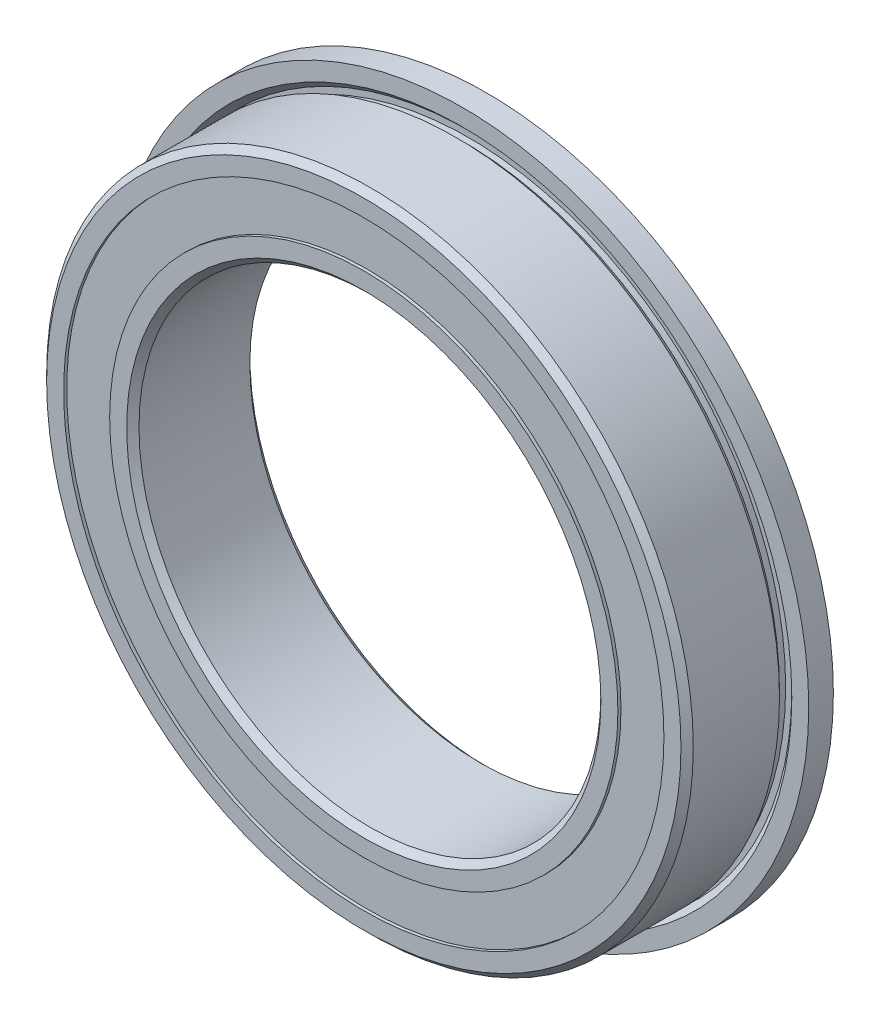
ISO-10303-21;
HEADER;
FILE_DESCRIPTION(('STEP AP214'),'2;1');
FILE_NAME('part.step','',(''),(''),'','','');
FILE_SCHEMA(('AUTOMOTIVE_DESIGN { 1 0 10303 214 1 1 1 1 }'));
ENDSEC;
DATA;
#1=APPLICATION_CONTEXT('core data for automotive mechanical design processes');
#2=APPLICATION_PROTOCOL_DEFINITION('international standard','automotive_design',2000,#1);
#3=PRODUCT_CONTEXT('',#1,'mechanical');
#4=PRODUCT('Part','Part','',(#3));
#5=PRODUCT_RELATED_PRODUCT_CATEGORY('part','',(#4));
#6=PRODUCT_DEFINITION_FORMATION('','',#4);
#7=PRODUCT_DEFINITION_CONTEXT('part definition',#1,'design');
#8=PRODUCT_DEFINITION('design','',#6,#7);
#9=PRODUCT_DEFINITION_SHAPE('','',#8);
#10=(LENGTH_UNIT() NAMED_UNIT(*) SI_UNIT(.MILLI.,.METRE.));
#11=(NAMED_UNIT(*) PLANE_ANGLE_UNIT() SI_UNIT($,.RADIAN.));
#12=(NAMED_UNIT(*) SI_UNIT($,.STERADIAN.) SOLID_ANGLE_UNIT());
#13=UNCERTAINTY_MEASURE_WITH_UNIT(LENGTH_MEASURE(1.E-05),#10,'distance_accuracy_value','');
#14=(GEOMETRIC_REPRESENTATION_CONTEXT(3) GLOBAL_UNCERTAINTY_ASSIGNED_CONTEXT((#13)) GLOBAL_UNIT_ASSIGNED_CONTEXT((#10,
#11,#12)) REPRESENTATION_CONTEXT('',''));
#15=CARTESIAN_POINT('',(0.,0.,0.));
#16=DIRECTION('',(0.,0.,1.));
#17=DIRECTION('',(1.,0.,0.));
#18=AXIS2_PLACEMENT_3D('',#15,#16,#17);
#19=CARTESIAN_POINT('',(0.,9.74725274725274,-1.90000000000001));
#20=DIRECTION('',(0.,0.,1.));
#21=DIRECTION('',(1.,0.,0.));
#22=AXIS2_PLACEMENT_3D('',#19,#20,#21);
#23=PLANE('',#22);
#24=CARTESIAN_POINT('',(0.,0.,-1.90000000000001));
#25=DIRECTION('',(0.,0.,1.));
#26=DIRECTION('',(1.,0.,0.));
#27=AXIS2_PLACEMENT_3D('',#24,#25,#26);
#28=CIRCLE('',#27,9.74725274725274);
#29=CARTESIAN_POINT('',(9.74725274725274,0.,-1.90000000000001));
#30=VERTEX_POINT('',#29);
#31=EDGE_CURVE('E74',#30,#30,#28,.T.);
#32=ORIENTED_EDGE('',*,*,#31,.F.);
#33=EDGE_LOOP('',(#32));
#34=FACE_BOUND('',#33,.T.);
#35=CARTESIAN_POINT('',(0.,0.,-1.90000000000001));
#36=DIRECTION('',(0.,0.,1.));
#37=DIRECTION('',(1.,0.,0.));
#38=AXIS2_PLACEMENT_3D('',#35,#36,#37);
#39=CIRCLE('',#38,8.25274725274726);
#40=CARTESIAN_POINT('',(8.25274725274726,0.,-1.90000000000001));
#41=VERTEX_POINT('',#40);
#42=EDGE_CURVE('E11',#41,#41,#39,.T.);
#43=ORIENTED_EDGE('',*,*,#42,.T.);
#44=EDGE_LOOP('',(#43));
#45=FACE_BOUND('',#44,.T.);
#46=ADVANCED_FACE('F56',(#34,#45),#23,.F.);
#47=CARTESIAN_POINT('',(0.,0.,2.));
#48=DIRECTION('',(0.,0.,1.));
#49=DIRECTION('',(1.,0.,0.));
#50=AXIS2_PLACEMENT_3D('',#47,#48,#49);
#51=CYLINDRICAL_SURFACE('',#50,8.25274725274726);
#52=ORIENTED_EDGE('',*,*,#42,.F.);
#53=EDGE_LOOP('',(#52));
#54=FACE_BOUND('',#53,.T.);
#55=CARTESIAN_POINT('',(0.,0.,-1.16125368678291));
#56=DIRECTION('',(0.,0.,1.));
#57=DIRECTION('',(1.,0.,0.));
#58=AXIS2_PLACEMENT_3D('',#55,#56,#57);
#59=CIRCLE('',#58,8.25274725274726);
#60=CARTESIAN_POINT('',(8.25274725274726,0.,-1.16125368678291));
#61=VERTEX_POINT('',#60);
#62=EDGE_CURVE('E62',#61,#61,#59,.T.);
#63=ORIENTED_EDGE('',*,*,#62,.T.);
#64=EDGE_LOOP('',(#63));
#65=FACE_BOUND('',#64,.T.);
#66=ADVANCED_FACE('F84',(#54,#65),#51,.F.);
#67=CARTESIAN_POINT('',(0.,9.74725274725274,-1.16125368678291));
#68=DIRECTION('',(0.,0.,-1.));
#69=DIRECTION('',(-1.,0.,0.));
#70=AXIS2_PLACEMENT_3D('',#67,#68,#69);
#71=PLANE('',#70);
#72=ORIENTED_EDGE('',*,*,#62,.F.);
#73=EDGE_LOOP('',(#72));
#74=FACE_BOUND('',#73,.T.);
#75=CARTESIAN_POINT('',(0.,0.,-1.16125368678291));
#76=DIRECTION('',(0.,0.,1.));
#77=DIRECTION('',(1.,0.,0.));
#78=AXIS2_PLACEMENT_3D('',#75,#76,#77);
#79=CIRCLE('',#78,9.74725274725274);
#80=CARTESIAN_POINT('',(9.74725274725274,0.,-1.16125368678291));
#81=VERTEX_POINT('',#80);
#82=EDGE_CURVE('E67',#81,#81,#79,.T.);
#83=ORIENTED_EDGE('',*,*,#82,.T.);
#84=EDGE_LOOP('',(#83));
#85=FACE_BOUND('',#84,.T.);
#86=ADVANCED_FACE('F89',(#74,#85),#71,.F.);
#87=CARTESIAN_POINT('',(0.,0.,2.));
#88=DIRECTION('',(0.,0.,1.));
#89=DIRECTION('',(1.,0.,0.));
#90=AXIS2_PLACEMENT_3D('',#87,#88,#89);
#91=CYLINDRICAL_SURFACE('',#90,9.74725274725274);
#92=ORIENTED_EDGE('',*,*,#82,.F.);
#93=EDGE_LOOP('',(#92));
#94=FACE_BOUND('',#93,.T.);
#95=ORIENTED_EDGE('',*,*,#31,.T.);
#96=EDGE_LOOP('',(#95));
#97=FACE_BOUND('',#96,.T.);
#98=ADVANCED_FACE('F81',(#94,#97),#91,.T.);
#99=CLOSED_SHELL('',(#46,#66,#86,#98));
#100=MANIFOLD_SOLID_BREP('B2',#99);
#101=CARTESIAN_POINT('',(0.,9.74725274725274,1.90000000000001));
#102=DIRECTION('',(0.,0.,-1.));
#103=DIRECTION('',(-1.,0.,0.));
#104=AXIS2_PLACEMENT_3D('',#101,#102,#103);
#105=PLANE('',#104);
#106=CARTESIAN_POINT('',(0.,0.,1.90000000000001));
#107=DIRECTION('',(0.,0.,1.));
#108=DIRECTION('',(1.,0.,0.));
#109=AXIS2_PLACEMENT_3D('',#106,#107,#108);
#110=CIRCLE('',#109,8.25274725274726);
#111=CARTESIAN_POINT('',(8.25274725274726,0.,1.90000000000001));
#112=VERTEX_POINT('',#111);
#113=EDGE_CURVE('E55',#112,#112,#110,.T.);
#114=ORIENTED_EDGE('',*,*,#113,.F.);
#115=EDGE_LOOP('',(#114));
#116=FACE_BOUND('',#115,.T.);
#117=CARTESIAN_POINT('',(0.,0.,1.90000000000001));
#118=DIRECTION('',(0.,0.,1.));
#119=DIRECTION('',(1.,0.,0.));
#120=AXIS2_PLACEMENT_3D('',#117,#118,#119);
#121=CIRCLE('',#120,9.74725274725274);
#122=CARTESIAN_POINT('',(9.74725274725274,0.,1.90000000000001));
#123=VERTEX_POINT('',#122);
#124=EDGE_CURVE('E146',#123,#123,#121,.T.);
#125=ORIENTED_EDGE('',*,*,#124,.T.);
#126=EDGE_LOOP('',(#125));
#127=FACE_BOUND('',#126,.T.);
#128=ADVANCED_FACE('F126',(#116,#127),#105,.F.);
#129=CARTESIAN_POINT('',(0.,0.,2.));
#130=DIRECTION('',(0.,0.,1.));
#131=DIRECTION('',(1.,0.,0.));
#132=AXIS2_PLACEMENT_3D('',#129,#130,#131);
#133=CYLINDRICAL_SURFACE('',#132,8.25274725274726);
#134=CARTESIAN_POINT('',(0.,0.,1.16125368678291));
#135=DIRECTION('',(0.,0.,1.));
#136=DIRECTION('',(1.,0.,0.));
#137=AXIS2_PLACEMENT_3D('',#134,#135,#136);
#138=CIRCLE('',#137,8.25274725274726);
#139=CARTESIAN_POINT('',(8.25274725274726,0.,1.16125368678291));
#140=VERTEX_POINT('',#139);
#141=EDGE_CURVE('E133',#140,#140,#138,.T.);
#142=ORIENTED_EDGE('',*,*,#141,.F.);
#143=EDGE_LOOP('',(#142));
#144=FACE_BOUND('',#143,.T.);
#145=ORIENTED_EDGE('',*,*,#113,.T.);
#146=EDGE_LOOP('',(#145));
#147=FACE_BOUND('',#146,.T.);
#148=ADVANCED_FACE('F162',(#144,#147),#133,.F.);
#149=CARTESIAN_POINT('',(0.,9.74725274725274,1.16125368678291));
#150=DIRECTION('',(0.,0.,1.));
#151=DIRECTION('',(1.,0.,0.));
#152=AXIS2_PLACEMENT_3D('',#149,#150,#151);
#153=PLANE('',#152);
#154=CARTESIAN_POINT('',(0.,0.,1.16125368678291));
#155=DIRECTION('',(0.,0.,1.));
#156=DIRECTION('',(1.,0.,0.));
#157=AXIS2_PLACEMENT_3D('',#154,#155,#156);
#158=CIRCLE('',#157,9.74725274725274);
#159=CARTESIAN_POINT('',(9.74725274725274,0.,1.16125368678291));
#160=VERTEX_POINT('',#159);
#161=EDGE_CURVE('E140',#160,#160,#158,.T.);
#162=ORIENTED_EDGE('',*,*,#161,.F.);
#163=EDGE_LOOP('',(#162));
#164=FACE_BOUND('',#163,.T.);
#165=ORIENTED_EDGE('',*,*,#141,.T.);
#166=EDGE_LOOP('',(#165));
#167=FACE_BOUND('',#166,.T.);
#168=ADVANCED_FACE('F157',(#164,#167),#153,.F.);
#169=CARTESIAN_POINT('',(0.,0.,2.));
#170=DIRECTION('',(0.,0.,1.));
#171=DIRECTION('',(1.,0.,0.));
#172=AXIS2_PLACEMENT_3D('',#169,#170,#171);
#173=CYLINDRICAL_SURFACE('',#172,9.74725274725274);
#174=ORIENTED_EDGE('',*,*,#124,.F.);
#175=EDGE_LOOP('',(#174));
#176=FACE_BOUND('',#175,.T.);
#177=ORIENTED_EDGE('',*,*,#161,.T.);
#178=EDGE_LOOP('',(#177));
#179=FACE_BOUND('',#178,.T.);
#180=ADVANCED_FACE('F154',(#176,#179),#173,.T.);
#181=CLOSED_SHELL('',(#128,#148,#168,#180));
#182=MANIFOLD_SOLID_BREP('B6',#181);
#183=CARTESIAN_POINT('',(-4.18250854839382,7.96910423087894,0.));
#184=DIRECTION('',(0.,0.,1.));
#185=DIRECTION('',(-0.464723172043757,0.885456025653216,0.));
#186=AXIS2_PLACEMENT_3D('',#183,#184,#185);
#187=SPHERICAL_SURFACE('',#186,1.16125368678291);
#188=CARTESIAN_POINT('',(-4.18250854839382,7.96910423087894,1.16125368678291));
#189=VERTEX_POINT('',#188);
#190=VERTEX_LOOP('',#189);
#191=FACE_BOUND('',#190,.T.);
#192=ADVANCED_FACE('F194',(#191),#187,.T.);
#193=CLOSED_SHELL('',(#192));
#194=MANIFOLD_SOLID_BREP('B50',#193);
#195=CARTESIAN_POINT('',(-7.40685479304284,5.11258272058049,0.));
#196=DIRECTION('',(0.,0.,1.));
#197=DIRECTION('',(-0.822983865893649,0.568064746731166,0.));
#198=AXIS2_PLACEMENT_3D('',#195,#196,#197);
#199=SPHERICAL_SURFACE('',#198,1.16125368678291);
#200=CARTESIAN_POINT('',(-7.40685479304284,5.11258272058049,1.16125368678291));
#201=VERTEX_POINT('',#200);
#202=VERTEX_LOOP('',#201);
#203=FACE_BOUND('',#202,.T.);
#204=ADVANCED_FACE('F213',(#203),#199,.T.);
#205=CLOSED_SHELL('',(#204));
#206=MANIFOLD_SOLID_BREP('B122',#205);
#207=CARTESIAN_POINT('',(-8.93437986688247,1.084830122298,0.));
#208=DIRECTION('',(0.,0.,1.));
#209=DIRECTION('',(-0.992708874098053,0.120536680255334,0.));
#210=AXIS2_PLACEMENT_3D('',#207,#208,#209);
#211=SPHERICAL_SURFACE('',#210,1.16125368678291);
#212=CARTESIAN_POINT('',(-8.93437986688247,1.084830122298,1.16125368678291));
#213=VERTEX_POINT('',#212);
#214=VERTEX_LOOP('',#213);
#215=FACE_BOUND('',#214,.T.);
#216=ADVANCED_FACE('F232',(#215),#211,.T.);
#217=CLOSED_SHELL('',(#216));
#218=MANIFOLD_SOLID_BREP('B190',#217);
#219=CARTESIAN_POINT('',(-8.41514618416876,-3.19144398338274,0.));
#220=DIRECTION('',(0.,0.,1.));
#221=DIRECTION('',(-0.935016242685418,-0.354604887042527,0.));
#222=AXIS2_PLACEMENT_3D('',#219,#220,#221);
#223=SPHERICAL_SURFACE('',#222,1.16125368678291);
#224=CARTESIAN_POINT('',(-8.41514618416876,-3.19144398338274,1.16125368678291));
#225=VERTEX_POINT('',#224);
#226=VERTEX_LOOP('',#225);
#227=FACE_BOUND('',#226,.T.);
#228=ADVANCED_FACE('F251',(#227),#223,.T.);
#229=CLOSED_SHELL('',(#228));
#230=MANIFOLD_SOLID_BREP('B209',#229);
#231=CARTESIAN_POINT('',(-5.96810392416721,-6.73659673353986,0.));
#232=DIRECTION('',(0.,0.,1.));
#233=DIRECTION('',(-0.663122658240802,-0.748510748171095,0.));
#234=AXIS2_PLACEMENT_3D('',#231,#232,#233);
#235=SPHERICAL_SURFACE('',#234,1.16125368678291);
#236=CARTESIAN_POINT('',(-5.96810392416721,-6.73659673353986,1.16125368678291));
#237=VERTEX_POINT('',#236);
#238=VERTEX_LOOP('',#237);
#239=FACE_BOUND('',#238,.T.);
#240=ADVANCED_FACE('F270',(#239),#235,.T.);
#241=CLOSED_SHELL('',(#240));
#242=MANIFOLD_SOLID_BREP('B228',#241);
#243=CARTESIAN_POINT('',(-2.15384097858809,-8.73847635683445,0.));
#244=DIRECTION('',(0.,0.,1.));
#245=DIRECTION('',(-0.239315664287565,-0.97094181742605,0.));
#246=AXIS2_PLACEMENT_3D('',#243,#244,#245);
#247=SPHERICAL_SURFACE('',#246,1.16125368678291);
#248=CARTESIAN_POINT('',(-2.15384097858809,-8.73847635683445,1.16125368678291));
#249=VERTEX_POINT('',#248);
#250=VERTEX_LOOP('',#249);
#251=FACE_BOUND('',#250,.T.);
#252=ADVANCED_FACE('F289',(#251),#247,.T.);
#253=CLOSED_SHELL('',(#252));
#254=MANIFOLD_SOLID_BREP('B247',#253);
#255=CARTESIAN_POINT('',(2.15384097858796,-8.73847635683448,0.));
#256=DIRECTION('',(0.,0.,1.));
#257=DIRECTION('',(0.239315664287552,-0.970941817426054,0.));
#258=AXIS2_PLACEMENT_3D('',#255,#256,#257);
#259=SPHERICAL_SURFACE('',#258,1.16125368678291);
#260=CARTESIAN_POINT('',(2.15384097858796,-8.73847635683448,1.16125368678291));
#261=VERTEX_POINT('',#260);
#262=VERTEX_LOOP('',#261);
#263=FACE_BOUND('',#262,.T.);
#264=ADVANCED_FACE('F308',(#263),#259,.T.);
#265=CLOSED_SHELL('',(#264));
#266=MANIFOLD_SOLID_BREP('B266',#265);
#267=CARTESIAN_POINT('',(5.96810392416712,-6.73659673353994,0.));
#268=DIRECTION('',(0.,0.,1.));
#269=DIRECTION('',(0.663122658240791,-0.748510748171105,0.));
#270=AXIS2_PLACEMENT_3D('',#267,#268,#269);
#271=SPHERICAL_SURFACE('',#270,1.16125368678291);
#272=CARTESIAN_POINT('',(5.96810392416712,-6.73659673353994,1.16125368678291));
#273=VERTEX_POINT('',#272);
#274=VERTEX_LOOP('',#273);
#275=FACE_BOUND('',#274,.T.);
#276=ADVANCED_FACE('F327',(#275),#271,.T.);
#277=CLOSED_SHELL('',(#276));
#278=MANIFOLD_SOLID_BREP('B285',#277);
#279=CARTESIAN_POINT('',(8.41514618416872,-3.19144398338286,0.));
#280=DIRECTION('',(0.,0.,1.));
#281=DIRECTION('',(0.935016242685413,-0.35460488704254,0.));
#282=AXIS2_PLACEMENT_3D('',#279,#280,#281);
#283=SPHERICAL_SURFACE('',#282,1.16125368678291);
#284=CARTESIAN_POINT('',(8.41514618416872,-3.19144398338286,1.16125368678291));
#285=VERTEX_POINT('',#284);
#286=VERTEX_LOOP('',#285);
#287=FACE_BOUND('',#286,.T.);
#288=ADVANCED_FACE('F346',(#287),#283,.T.);
#289=CLOSED_SHELL('',(#288));
#290=MANIFOLD_SOLID_BREP('B304',#289);
#291=CARTESIAN_POINT('',(8.93437986688249,1.08483012229788,0.));
#292=DIRECTION('',(0.,0.,1.));
#293=DIRECTION('',(0.992708874098054,0.12053668025532,0.));
#294=AXIS2_PLACEMENT_3D('',#291,#292,#293);
#295=SPHERICAL_SURFACE('',#294,1.16125368678291);
#296=CARTESIAN_POINT('',(8.93437986688249,1.08483012229788,1.16125368678291));
#297=VERTEX_POINT('',#296);
#298=VERTEX_LOOP('',#297);
#299=FACE_BOUND('',#298,.T.);
#300=ADVANCED_FACE('F365',(#299),#295,.T.);
#301=CLOSED_SHELL('',(#300));
#302=MANIFOLD_SOLID_BREP('B323',#301);
#303=CARTESIAN_POINT('',(7.40685479304292,5.11258272058039,0.));
#304=DIRECTION('',(0.,0.,1.));
#305=DIRECTION('',(0.822983865893658,0.568064746731154,0.));
#306=AXIS2_PLACEMENT_3D('',#303,#304,#305);
#307=SPHERICAL_SURFACE('',#306,1.16125368678291);
#308=CARTESIAN_POINT('',(7.40685479304292,5.11258272058039,1.16125368678291));
#309=VERTEX_POINT('',#308);
#310=VERTEX_LOOP('',#309);
#311=FACE_BOUND('',#310,.T.);
#312=ADVANCED_FACE('F384',(#311),#307,.T.);
#313=CLOSED_SHELL('',(#312));
#314=MANIFOLD_SOLID_BREP('B342',#313);
#315=CARTESIAN_POINT('',(4.18250854839392,7.96910423087888,0.));
#316=DIRECTION('',(0.,0.,1.));
#317=DIRECTION('',(0.46472317204377,0.885456025653209,0.));
#318=AXIS2_PLACEMENT_3D('',#315,#316,#317);
#319=SPHERICAL_SURFACE('',#318,1.16125368678291);
#320=CARTESIAN_POINT('',(4.18250854839392,7.96910423087888,1.16125368678291));
#321=VERTEX_POINT('',#320);
#322=VERTEX_LOOP('',#321);
#323=FACE_BOUND('',#322,.T.);
#324=ADVANCED_FACE('F403',(#323),#319,.T.);
#325=CLOSED_SHELL('',(#324));
#326=MANIFOLD_SOLID_BREP('B361',#325);
#327=CARTESIAN_POINT('',(0.,9.,0.));
#328=DIRECTION('',(0.,0.,1.));
#329=DIRECTION('',(0.,1.,0.));
#330=AXIS2_PLACEMENT_3D('',#327,#328,#329);
#331=SPHERICAL_SURFACE('',#330,1.16125368678291);
#332=CARTESIAN_POINT('',(0.,9.,1.16125368678291));
#333=VERTEX_POINT('',#332);
#334=VERTEX_LOOP('',#333);
#335=FACE_BOUND('',#334,.T.);
#336=ADVANCED_FACE('F424',(#335),#331,.T.);
#337=CLOSED_SHELL('',(#336));
#338=MANIFOLD_SOLID_BREP('B380',#337);
#339=CARTESIAN_POINT('',(0.,9.37362637362637,0.124542124542124));
#340=DIRECTION('',(0.,0.,-1.));
#341=DIRECTION('',(-1.,0.,0.));
#342=AXIS2_PLACEMENT_3D('',#339,#340,#341);
#343=PLANE('',#342);
#344=CARTESIAN_POINT('',(0.,0.,0.124542124542124));
#345=DIRECTION('',(0.,0.,1.));
#346=DIRECTION('',(1.,0.,0.));
#347=AXIS2_PLACEMENT_3D('',#344,#345,#346);
#348=CIRCLE('',#347,8.62637362637362);
#349=CARTESIAN_POINT('',(8.62637362637362,0.,0.124542124542124));
#350=VERTEX_POINT('',#349);
#351=EDGE_CURVE('E423',#350,#350,#348,.T.);
#352=ORIENTED_EDGE('',*,*,#351,.F.);
#353=EDGE_LOOP('',(#352));
#354=FACE_BOUND('',#353,.T.);
#355=CARTESIAN_POINT('',(0.,0.,0.124542124542124));
#356=DIRECTION('',(0.,0.,1.));
#357=DIRECTION('',(1.,0.,0.));
#358=AXIS2_PLACEMENT_3D('',#355,#356,#357);
#359=CIRCLE('',#358,9.37362637362637);
#360=CARTESIAN_POINT('',(9.37362637362637,0.,0.124542124542124));
#361=VERTEX_POINT('',#360);
#362=EDGE_CURVE('E462',#361,#361,#359,.T.);
#363=ORIENTED_EDGE('',*,*,#362,.T.);
#364=EDGE_LOOP('',(#363));
#365=FACE_BOUND('',#364,.T.);
#366=ADVANCED_FACE('F443',(#354,#365),#343,.F.);
#367=CARTESIAN_POINT('',(0.,0.,2.));
#368=DIRECTION('',(0.,0.,1.));
#369=DIRECTION('',(1.,0.,0.));
#370=AXIS2_PLACEMENT_3D('',#367,#368,#369);
#371=CYLINDRICAL_SURFACE('',#370,8.62637362637362);
#372=CARTESIAN_POINT('',(0.,0.,-0.124542124542125));
#373=DIRECTION('',(0.,0.,1.));
#374=DIRECTION('',(1.,0.,0.));
#375=AXIS2_PLACEMENT_3D('',#372,#373,#374);
#376=CIRCLE('',#375,8.62637362637362);
#377=CARTESIAN_POINT('',(8.62637362637362,0.,-0.124542124542125));
#378=VERTEX_POINT('',#377);
#379=EDGE_CURVE('E450',#378,#378,#376,.T.);
#380=ORIENTED_EDGE('',*,*,#379,.F.);
#381=EDGE_LOOP('',(#380));
#382=FACE_BOUND('',#381,.T.);
#383=ORIENTED_EDGE('',*,*,#351,.T.);
#384=EDGE_LOOP('',(#383));
#385=FACE_BOUND('',#384,.T.);
#386=ADVANCED_FACE('F479',(#382,#385),#371,.F.);
#387=CARTESIAN_POINT('',(0.,9.37362637362637,-0.124542124542125));
#388=DIRECTION('',(0.,0.,1.));
#389=DIRECTION('',(1.,0.,0.));
#390=AXIS2_PLACEMENT_3D('',#387,#388,#389);
#391=PLANE('',#390);
#392=CARTESIAN_POINT('',(0.,0.,-0.124542124542125));
#393=DIRECTION('',(0.,0.,1.));
#394=DIRECTION('',(1.,0.,0.));
#395=AXIS2_PLACEMENT_3D('',#392,#393,#394);
#396=CIRCLE('',#395,9.37362637362637);
#397=CARTESIAN_POINT('',(9.37362637362637,0.,-0.124542124542125));
#398=VERTEX_POINT('',#397);
#399=EDGE_CURVE('E457',#398,#398,#396,.T.);
#400=ORIENTED_EDGE('',*,*,#399,.F.);
#401=EDGE_LOOP('',(#400));
#402=FACE_BOUND('',#401,.T.);
#403=ORIENTED_EDGE('',*,*,#379,.T.);
#404=EDGE_LOOP('',(#403));
#405=FACE_BOUND('',#404,.T.);
#406=ADVANCED_FACE('F474',(#402,#405),#391,.F.);
#407=CARTESIAN_POINT('',(0.,0.,2.));
#408=DIRECTION('',(0.,0.,1.));
#409=DIRECTION('',(1.,0.,0.));
#410=AXIS2_PLACEMENT_3D('',#407,#408,#409);
#411=CYLINDRICAL_SURFACE('',#410,9.37362637362637);
#412=ORIENTED_EDGE('',*,*,#362,.F.);
#413=EDGE_LOOP('',(#412));
#414=FACE_BOUND('',#413,.T.);
#415=ORIENTED_EDGE('',*,*,#399,.T.);
#416=EDGE_LOOP('',(#415));
#417=FACE_BOUND('',#416,.T.);
#418=ADVANCED_FACE('F471',(#414,#417),#411,.T.);
#419=CLOSED_SHELL('',(#366,#386,#406,#418));
#420=MANIFOLD_SOLID_BREP('B399',#419);
#421=CARTESIAN_POINT('',(0.,8.25274725274726,2.));
#422=DIRECTION('',(0.,0.,-1.));
#423=DIRECTION('',(-1.,0.,0.));
#424=AXIS2_PLACEMENT_3D('',#421,#422,#423);
#425=PLANE('',#424);
#426=CARTESIAN_POINT('',(0.,0.,2.));
#427=DIRECTION('',(0.,0.,1.));
#428=DIRECTION('',(1.,0.,0.));
#429=AXIS2_PLACEMENT_3D('',#426,#427,#428);
#430=CIRCLE('',#429,7.69999999999998);
#431=CARTESIAN_POINT('',(7.69999999999998,0.,2.));
#432=VERTEX_POINT('',#431);
#433=EDGE_CURVE('E549',#432,#432,#430,.T.);
#434=ORIENTED_EDGE('',*,*,#433,.F.);
#435=EDGE_LOOP('',(#434));
#436=FACE_BOUND('',#435,.T.);
#437=CARTESIAN_POINT('',(0.,0.,2.));
#438=DIRECTION('',(0.,0.,1.));
#439=DIRECTION('',(1.,0.,0.));
#440=AXIS2_PLACEMENT_3D('',#437,#438,#439);
#441=CIRCLE('',#440,8.25274725274726);
#442=CARTESIAN_POINT('',(8.25274725274726,0.,2.));
#443=VERTEX_POINT('',#442);
#444=EDGE_CURVE('E442',#443,#443,#441,.T.);
#445=ORIENTED_EDGE('',*,*,#444,.T.);
#446=EDGE_LOOP('',(#445));
#447=FACE_BOUND('',#446,.T.);
#448=ADVANCED_FACE('F512',(#436,#447),#425,.F.);
#449=CARTESIAN_POINT('',(0.,0.,2.));
#450=DIRECTION('',(0.,0.,1.));
#451=DIRECTION('',(1.,0.,0.));
#452=AXIS2_PLACEMENT_3D('',#449,#450,#451);
#453=CYLINDRICAL_SURFACE('',#452,8.25274725274726);
#454=ORIENTED_EDGE('',*,*,#444,.F.);
#455=EDGE_LOOP('',(#454));
#456=FACE_BOUND('',#455,.T.);
#457=CARTESIAN_POINT('',(0.,0.,0.888888888888888));
#458=DIRECTION('',(0.,0.,1.));
#459=DIRECTION('',(1.,0.,0.));
#460=AXIS2_PLACEMENT_3D('',#457,#458,#459);
#461=CIRCLE('',#460,8.25274725274726);
#462=CARTESIAN_POINT('',(8.25274725274726,0.,0.888888888888888));
#463=VERTEX_POINT('',#462);
#464=EDGE_CURVE('E519',#463,#463,#461,.T.);
#465=ORIENTED_EDGE('',*,*,#464,.T.);
#466=EDGE_LOOP('',(#465));
#467=FACE_BOUND('',#466,.T.);
#468=ADVANCED_FACE('F557',(#456,#467),#453,.T.);
#469=CARTESIAN_POINT('',(0.,0.,0.));
#470=DIRECTION('',(0.,0.,1.));
#471=DIRECTION('',(1.,0.,0.));
#472=AXIS2_PLACEMENT_3D('',#469,#470,#471);
#473=TOROIDAL_SURFACE('',#472,9.,1.16125368678291);
#474=ORIENTED_EDGE('',*,*,#464,.F.);
#475=EDGE_LOOP('',(#474));
#476=FACE_BOUND('',#475,.T.);
#477=CARTESIAN_POINT('',(0.,0.,-0.888888888888889));
#478=DIRECTION('',(0.,0.,1.));
#479=DIRECTION('',(1.,0.,0.));
#480=AXIS2_PLACEMENT_3D('',#477,#478,#479);
#481=CIRCLE('',#480,8.25274725274726);
#482=CARTESIAN_POINT('',(8.25274725274726,0.,-0.888888888888889));
#483=VERTEX_POINT('',#482);
#484=EDGE_CURVE('E526',#483,#483,#481,.T.);
#485=ORIENTED_EDGE('',*,*,#484,.T.);
#486=EDGE_LOOP('',(#485));
#487=FACE_BOUND('',#486,.T.);
#488=ADVANCED_FACE('F561',(#476,#487),#473,.F.);
#489=CARTESIAN_POINT('',(0.,0.,2.));
#490=DIRECTION('',(0.,0.,1.));
#491=DIRECTION('',(1.,0.,0.));
#492=AXIS2_PLACEMENT_3D('',#489,#490,#491);
#493=CYLINDRICAL_SURFACE('',#492,8.25274725274726);
#494=ORIENTED_EDGE('',*,*,#484,.F.);
#495=EDGE_LOOP('',(#494));
#496=FACE_BOUND('',#495,.T.);
#497=CARTESIAN_POINT('',(0.,0.,-2.));
#498=DIRECTION('',(0.,0.,1.));
#499=DIRECTION('',(1.,0.,0.));
#500=AXIS2_PLACEMENT_3D('',#497,#498,#499);
#501=CIRCLE('',#500,8.25274725274726);
#502=CARTESIAN_POINT('',(8.25274725274726,0.,-2.));
#503=VERTEX_POINT('',#502);
#504=EDGE_CURVE('E533',#503,#503,#501,.T.);
#505=ORIENTED_EDGE('',*,*,#504,.T.);
#506=EDGE_LOOP('',(#505));
#507=FACE_BOUND('',#506,.T.);
#508=ADVANCED_FACE('F566',(#496,#507),#493,.T.);
#509=CARTESIAN_POINT('',(0.,7.69999999999999,-2.));
#510=DIRECTION('',(0.,0.,1.));
#511=DIRECTION('',(1.,0.,0.));
#512=AXIS2_PLACEMENT_3D('',#509,#510,#511);
#513=PLANE('',#512);
#514=ORIENTED_EDGE('',*,*,#504,.F.);
#515=EDGE_LOOP('',(#514));
#516=FACE_BOUND('',#515,.T.);
#517=CARTESIAN_POINT('',(0.,0.,-2.));
#518=DIRECTION('',(0.,0.,1.));
#519=DIRECTION('',(1.,0.,0.));
#520=AXIS2_PLACEMENT_3D('',#517,#518,#519);
#521=CIRCLE('',#520,7.69999999999999);
#522=CARTESIAN_POINT('',(7.69999999999999,0.,-2.));
#523=VERTEX_POINT('',#522);
#524=EDGE_CURVE('E538',#523,#523,#521,.T.);
#525=ORIENTED_EDGE('',*,*,#524,.T.);
#526=EDGE_LOOP('',(#525));
#527=FACE_BOUND('',#526,.T.);
#528=ADVANCED_FACE('F572',(#516,#527),#513,.F.);
#529=CARTESIAN_POINT('',(0.,0.,-1.80000000000002));
#530=DIRECTION('',(0.,0.,-1.));
#531=DIRECTION('',(-1.,0.,0.));
#532=AXIS2_PLACEMENT_3D('',#529,#530,#531);
#533=CONICAL_SURFACE('',#532,7.5,0.785398163397478);
#534=ORIENTED_EDGE('',*,*,#524,.F.);
#535=EDGE_LOOP('',(#534));
#536=FACE_BOUND('',#535,.T.);
#537=CARTESIAN_POINT('',(0.,0.,-1.80000000000002));
#538=DIRECTION('',(0.,0.,1.));
#539=DIRECTION('',(1.,0.,0.));
#540=AXIS2_PLACEMENT_3D('',#537,#538,#539);
#541=CIRCLE('',#540,7.5);
#542=CARTESIAN_POINT('',(7.5,0.,-1.80000000000002));
#543=VERTEX_POINT('',#542);
#544=EDGE_CURVE('E542',#543,#543,#541,.T.);
#545=ORIENTED_EDGE('',*,*,#544,.T.);
#546=EDGE_LOOP('',(#545));
#547=FACE_BOUND('',#546,.T.);
#548=ADVANCED_FACE('F576',(#536,#547),#533,.F.);
#549=CARTESIAN_POINT('',(0.,0.,2.));
#550=DIRECTION('',(0.,0.,1.));
#551=DIRECTION('',(1.,0.,0.));
#552=AXIS2_PLACEMENT_3D('',#549,#550,#551);
#553=CYLINDRICAL_SURFACE('',#552,7.5);
#554=ORIENTED_EDGE('',*,*,#544,.F.);
#555=EDGE_LOOP('',(#554));
#556=FACE_BOUND('',#555,.T.);
#557=CARTESIAN_POINT('',(0.,0.,1.80000000000001));
#558=DIRECTION('',(0.,0.,1.));
#559=DIRECTION('',(1.,0.,0.));
#560=AXIS2_PLACEMENT_3D('',#557,#558,#559);
#561=CIRCLE('',#560,7.5);
#562=CARTESIAN_POINT('',(7.5,0.,1.80000000000001));
#563=VERTEX_POINT('',#562);
#564=EDGE_CURVE('E545',#563,#563,#561,.T.);
#565=ORIENTED_EDGE('',*,*,#564,.T.);
#566=EDGE_LOOP('',(#565));
#567=FACE_BOUND('',#566,.T.);
#568=ADVANCED_FACE('F580',(#556,#567),#553,.F.);
#569=CARTESIAN_POINT('',(0.,0.,2.));
#570=DIRECTION('',(0.,0.,1.));
#571=DIRECTION('',(1.,0.,0.));
#572=AXIS2_PLACEMENT_3D('',#569,#570,#571);
#573=CONICAL_SURFACE('',#572,7.69999999999998,0.785398163397418);
#574=ORIENTED_EDGE('',*,*,#564,.F.);
#575=EDGE_LOOP('',(#574));
#576=FACE_BOUND('',#575,.T.);
#577=ORIENTED_EDGE('',*,*,#433,.T.);
#578=EDGE_LOOP('',(#577));
#579=FACE_BOUND('',#578,.T.);
#580=ADVANCED_FACE('F554',(#576,#579),#573,.F.);
#581=CLOSED_SHELL('',(#448,#468,#488,#508,#528,#548,#568,#580));
#582=MANIFOLD_SOLID_BREP('B418',#581);
#583=CARTESIAN_POINT('',(0.,0.,2.));
#584=DIRECTION('',(0.,0.,1.));
#585=DIRECTION('',(1.,0.,0.));
#586=AXIS2_PLACEMENT_3D('',#583,#584,#585);
#587=CYLINDRICAL_SURFACE('',#586,11.25);
#588=CARTESIAN_POINT('',(0.,0.,-1.2));
#589=DIRECTION('',(0.,0.,1.));
#590=DIRECTION('',(1.,0.,0.));
#591=AXIS2_PLACEMENT_3D('',#588,#589,#590);
#592=CIRCLE('',#591,11.25);
#593=CARTESIAN_POINT('',(11.25,0.,-1.2));
#594=VERTEX_POINT('',#593);
#595=EDGE_CURVE('E643',#594,#594,#592,.T.);
#596=ORIENTED_EDGE('',*,*,#595,.F.);
#597=EDGE_LOOP('',(#596));
#598=FACE_BOUND('',#597,.T.);
#599=CARTESIAN_POINT('',(0.,0.,-2.));
#600=DIRECTION('',(0.,0.,1.));
#601=DIRECTION('',(1.,0.,0.));
#602=AXIS2_PLACEMENT_3D('',#599,#600,#601);
#603=CIRCLE('',#602,11.25);
#604=CARTESIAN_POINT('',(11.25,0.,-2.));
#605=VERTEX_POINT('',#604);
#606=EDGE_CURVE('E511',#605,#605,#603,.T.);
#607=ORIENTED_EDGE('',*,*,#606,.T.);
#608=EDGE_LOOP('',(#607));
#609=FACE_BOUND('',#608,.T.);
#610=ADVANCED_FACE('F636',(#598,#609),#587,.T.);
#611=CARTESIAN_POINT('',(0.,11.25,-1.2));
#612=DIRECTION('',(0.,0.,-1.));
#613=DIRECTION('',(-1.,0.,0.));
#614=AXIS2_PLACEMENT_3D('',#611,#612,#613);
#615=PLANE('',#614);
#616=CARTESIAN_POINT('',(0.,0.,-1.2));
#617=DIRECTION('',(0.,0.,1.));
#618=DIRECTION('',(1.,0.,0.));
#619=AXIS2_PLACEMENT_3D('',#616,#617,#618);
#620=CIRCLE('',#619,10.7);
#621=CARTESIAN_POINT('',(10.7,0.,-1.2));
#622=VERTEX_POINT('',#621);
#623=EDGE_CURVE('E651',#622,#622,#620,.T.);
#624=ORIENTED_EDGE('',*,*,#623,.F.);
#625=EDGE_LOOP('',(#624));
#626=FACE_BOUND('',#625,.T.);
#627=ORIENTED_EDGE('',*,*,#595,.T.);
#628=EDGE_LOOP('',(#627));
#629=FACE_BOUND('',#628,.T.);
#630=ADVANCED_FACE('F758',(#626,#629),#615,.F.);
#631=CARTESIAN_POINT('',(0.,0.,-1.2));
#632=DIRECTION('',(0.,0.,1.));
#633=DIRECTION('',(1.,0.,0.));
#634=AXIS2_PLACEMENT_3D('',#631,#632,#633);
#635=CONICAL_SURFACE('',#634,10.7,0.785398163397422);
#636=CARTESIAN_POINT('',(0.,0.,-1.39999999999998));
#637=DIRECTION('',(0.,0.,1.));
#638=DIRECTION('',(1.,0.,0.));
#639=AXIS2_PLACEMENT_3D('',#636,#637,#638);
#640=CIRCLE('',#639,10.5);
#641=CARTESIAN_POINT('',(10.5,0.,-1.39999999999998));
#642=VERTEX_POINT('',#641);
#643=EDGE_CURVE('E659',#642,#642,#640,.T.);
#644=ORIENTED_EDGE('',*,*,#643,.F.);
#645=EDGE_LOOP('',(#644));
#646=FACE_BOUND('',#645,.T.);
#647=ORIENTED_EDGE('',*,*,#623,.T.);
#648=EDGE_LOOP('',(#647));
#649=FACE_BOUND('',#648,.T.);
#650=ADVANCED_FACE('F752',(#646,#649),#635,.F.);
#651=CARTESIAN_POINT('',(0.,10.5,-1.39999999999998));
#652=DIRECTION('',(0.,0.,-1.));
#653=DIRECTION('',(-1.,0.,0.));
#654=AXIS2_PLACEMENT_3D('',#651,#652,#653);
#655=PLANE('',#654);
#656=CARTESIAN_POINT('',(0.,0.,-1.39999999999998));
#657=DIRECTION('',(0.,0.,1.));
#658=DIRECTION('',(1.,0.,0.));
#659=AXIS2_PLACEMENT_3D('',#656,#657,#658);
#660=CIRCLE('',#659,10.3);
#661=CARTESIAN_POINT('',(10.3,0.,-1.39999999999998));
#662=VERTEX_POINT('',#661);
#663=EDGE_CURVE('E664',#662,#662,#660,.T.);
#664=ORIENTED_EDGE('',*,*,#663,.F.);
#665=EDGE_LOOP('',(#664));
#666=FACE_BOUND('',#665,.T.);
#667=ORIENTED_EDGE('',*,*,#643,.T.);
#668=EDGE_LOOP('',(#667));
#669=FACE_BOUND('',#668,.T.);
#670=ADVANCED_FACE('F746',(#666,#669),#655,.F.);
#671=CARTESIAN_POINT('',(0.,0.,2.));
#672=DIRECTION('',(0.,0.,1.));
#673=DIRECTION('',(1.,0.,0.));
#674=AXIS2_PLACEMENT_3D('',#671,#672,#673);
#675=CYLINDRICAL_SURFACE('',#674,10.3);
#676=CARTESIAN_POINT('',(0.,0.,-1.2));
#677=DIRECTION('',(0.,0.,1.));
#678=DIRECTION('',(1.,0.,0.));
#679=AXIS2_PLACEMENT_3D('',#676,#677,#678);
#680=CIRCLE('',#679,10.3);
#681=CARTESIAN_POINT('',(10.3,0.,-1.2));
#682=VERTEX_POINT('',#681);
#683=EDGE_CURVE('E668',#682,#682,#680,.T.);
#684=ORIENTED_EDGE('',*,*,#683,.F.);
#685=EDGE_LOOP('',(#684));
#686=FACE_BOUND('',#685,.T.);
#687=ORIENTED_EDGE('',*,*,#663,.T.);
#688=EDGE_LOOP('',(#687));
#689=FACE_BOUND('',#688,.T.);
#690=ADVANCED_FACE('F740',(#686,#689),#675,.T.);
#691=CARTESIAN_POINT('',(0.,0.,-1.2));
#692=DIRECTION('',(0.,0.,1.));
#693=DIRECTION('',(1.,0.,0.));
#694=AXIS2_PLACEMENT_3D('',#691,#692,#693);
#695=CONICAL_SURFACE('',#694,10.3,0.785398163397433);
#696=CARTESIAN_POINT('',(0.,0.,-1.00000000000002));
#697=DIRECTION('',(0.,0.,1.));
#698=DIRECTION('',(1.,0.,0.));
#699=AXIS2_PLACEMENT_3D('',#696,#697,#698);
#700=CIRCLE('',#699,10.5);
#701=CARTESIAN_POINT('',(10.5,0.,-1.00000000000002));
#702=VERTEX_POINT('',#701);
#703=EDGE_CURVE('E672',#702,#702,#700,.T.);
#704=ORIENTED_EDGE('',*,*,#703,.F.);
#705=EDGE_LOOP('',(#704));
#706=FACE_BOUND('',#705,.T.);
#707=ORIENTED_EDGE('',*,*,#683,.T.);
#708=EDGE_LOOP('',(#707));
#709=FACE_BOUND('',#708,.T.);
#710=ADVANCED_FACE('F734',(#706,#709),#695,.T.);
#711=CARTESIAN_POINT('',(0.,0.,2.));
#712=DIRECTION('',(0.,0.,1.));
#713=DIRECTION('',(1.,0.,0.));
#714=AXIS2_PLACEMENT_3D('',#711,#712,#713);
#715=CYLINDRICAL_SURFACE('',#714,10.5);
#716=CARTESIAN_POINT('',(0.,0.,1.80000000000002));
#717=DIRECTION('',(0.,0.,1.));
#718=DIRECTION('',(1.,0.,0.));
#719=AXIS2_PLACEMENT_3D('',#716,#717,#718);
#720=CIRCLE('',#719,10.5);
#721=CARTESIAN_POINT('',(10.5,0.,1.80000000000002));
#722=VERTEX_POINT('',#721);
#723=EDGE_CURVE('E675',#722,#722,#720,.T.);
#724=ORIENTED_EDGE('',*,*,#723,.F.);
#725=EDGE_LOOP('',(#724));
#726=FACE_BOUND('',#725,.T.);
#727=ORIENTED_EDGE('',*,*,#703,.T.);
#728=EDGE_LOOP('',(#727));
#729=FACE_BOUND('',#728,.T.);
#730=ADVANCED_FACE('F728',(#726,#729),#715,.T.);
#731=CARTESIAN_POINT('',(0.,0.,1.80000000000002));
#732=DIRECTION('',(0.,0.,-1.));
#733=DIRECTION('',(-1.,0.,0.));
#734=AXIS2_PLACEMENT_3D('',#731,#732,#733);
#735=CONICAL_SURFACE('',#734,10.5,0.785398163397476);
#736=CARTESIAN_POINT('',(0.,0.,2.));
#737=DIRECTION('',(0.,0.,1.));
#738=DIRECTION('',(1.,0.,0.));
#739=AXIS2_PLACEMENT_3D('',#736,#737,#738);
#740=CIRCLE('',#739,10.3);
#741=CARTESIAN_POINT('',(10.3,0.,2.));
#742=VERTEX_POINT('',#741);
#743=EDGE_CURVE('E679',#742,#742,#740,.T.);
#744=ORIENTED_EDGE('',*,*,#743,.F.);
#745=EDGE_LOOP('',(#744));
#746=FACE_BOUND('',#745,.T.);
#747=ORIENTED_EDGE('',*,*,#723,.T.);
#748=EDGE_LOOP('',(#747));
#749=FACE_BOUND('',#748,.T.);
#750=ADVANCED_FACE('F722',(#746,#749),#735,.T.);
#751=CARTESIAN_POINT('',(0.,10.3,2.));
#752=DIRECTION('',(0.,0.,-1.));
#753=DIRECTION('',(-1.,0.,0.));
#754=AXIS2_PLACEMENT_3D('',#751,#752,#753);
#755=PLANE('',#754);
#756=CARTESIAN_POINT('',(0.,0.,2.));
#757=DIRECTION('',(0.,0.,1.));
#758=DIRECTION('',(1.,0.,0.));
#759=AXIS2_PLACEMENT_3D('',#756,#757,#758);
#760=CIRCLE('',#759,9.74725274725274);
#761=CARTESIAN_POINT('',(9.74725274725274,0.,2.));
#762=VERTEX_POINT('',#761);
#763=EDGE_CURVE('E683',#762,#762,#760,.T.);
#764=ORIENTED_EDGE('',*,*,#763,.F.);
#765=EDGE_LOOP('',(#764));
#766=FACE_BOUND('',#765,.T.);
#767=ORIENTED_EDGE('',*,*,#743,.T.);
#768=EDGE_LOOP('',(#767));
#769=FACE_BOUND('',#768,.T.);
#770=ADVANCED_FACE('F716',(#766,#769),#755,.F.);
#771=CARTESIAN_POINT('',(0.,0.,2.));
#772=DIRECTION('',(0.,0.,1.));
#773=DIRECTION('',(1.,0.,0.));
#774=AXIS2_PLACEMENT_3D('',#771,#772,#773);
#775=CYLINDRICAL_SURFACE('',#774,9.74725274725274);
#776=CARTESIAN_POINT('',(0.,0.,0.888888888888888));
#777=DIRECTION('',(0.,0.,1.));
#778=DIRECTION('',(1.,0.,0.));
#779=AXIS2_PLACEMENT_3D('',#776,#777,#778);
#780=CIRCLE('',#779,9.74725274725274);
#781=CARTESIAN_POINT('',(9.74725274725274,0.,0.888888888888888));
#782=VERTEX_POINT('',#781);
#783=EDGE_CURVE('E687',#782,#782,#780,.T.);
#784=ORIENTED_EDGE('',*,*,#783,.F.);
#785=EDGE_LOOP('',(#784));
#786=FACE_BOUND('',#785,.T.);
#787=ORIENTED_EDGE('',*,*,#763,.T.);
#788=EDGE_LOOP('',(#787));
#789=FACE_BOUND('',#788,.T.);
#790=ADVANCED_FACE('F710',(#786,#789),#775,.F.);
#791=CARTESIAN_POINT('',(0.,0.,0.));
#792=DIRECTION('',(0.,0.,1.));
#793=DIRECTION('',(1.,0.,0.));
#794=AXIS2_PLACEMENT_3D('',#791,#792,#793);
#795=TOROIDAL_SURFACE('',#794,9.,1.16125368678291);
#796=CARTESIAN_POINT('',(0.,0.,-0.88888888888889));
#797=DIRECTION('',(0.,0.,1.));
#798=DIRECTION('',(1.,0.,0.));
#799=AXIS2_PLACEMENT_3D('',#796,#797,#798);
#800=CIRCLE('',#799,9.74725274725274);
#801=CARTESIAN_POINT('',(9.74725274725274,0.,-0.88888888888889));
#802=VERTEX_POINT('',#801);
#803=EDGE_CURVE('E690',#802,#802,#800,.T.);
#804=ORIENTED_EDGE('',*,*,#803,.F.);
#805=EDGE_LOOP('',(#804));
#806=FACE_BOUND('',#805,.T.);
#807=ORIENTED_EDGE('',*,*,#783,.T.);
#808=EDGE_LOOP('',(#807));
#809=FACE_BOUND('',#808,.T.);
#810=ADVANCED_FACE('F704',(#806,#809),#795,.F.);
#811=CARTESIAN_POINT('',(0.,0.,2.));
#812=DIRECTION('',(0.,0.,1.));
#813=DIRECTION('',(1.,0.,0.));
#814=AXIS2_PLACEMENT_3D('',#811,#812,#813);
#815=CYLINDRICAL_SURFACE('',#814,9.74725274725274);
#816=CARTESIAN_POINT('',(0.,0.,-2.));
#817=DIRECTION('',(0.,0.,1.));
#818=DIRECTION('',(1.,0.,0.));
#819=AXIS2_PLACEMENT_3D('',#816,#817,#818);
#820=CIRCLE('',#819,9.74725274725274);
#821=CARTESIAN_POINT('',(9.74725274725274,0.,-2.));
#822=VERTEX_POINT('',#821);
#823=EDGE_CURVE('E693',#822,#822,#820,.T.);
#824=ORIENTED_EDGE('',*,*,#823,.F.);
#825=EDGE_LOOP('',(#824));
#826=FACE_BOUND('',#825,.T.);
#827=ORIENTED_EDGE('',*,*,#803,.T.);
#828=EDGE_LOOP('',(#827));
#829=FACE_BOUND('',#828,.T.);
#830=ADVANCED_FACE('F701',(#826,#829),#815,.F.);
#831=CARTESIAN_POINT('',(0.,9.74725274725274,-2.));
#832=DIRECTION('',(0.,0.,1.));
#833=DIRECTION('',(1.,0.,0.));
#834=AXIS2_PLACEMENT_3D('',#831,#832,#833);
#835=PLANE('',#834);
#836=ORIENTED_EDGE('',*,*,#606,.F.);
#837=EDGE_LOOP('',(#836));
#838=FACE_BOUND('',#837,.T.);
#839=ORIENTED_EDGE('',*,*,#823,.T.);
#840=EDGE_LOOP('',(#839));
#841=FACE_BOUND('',#840,.T.);
#842=ADVANCED_FACE('F699',(#838,#841),#835,.F.);
#843=CLOSED_SHELL('',(#610,#630,#650,#670,#690,#710,#730,#750,#770,#790,#810,#830,#842));
#844=MANIFOLD_SOLID_BREP('B437',#843);
#845=ADVANCED_BREP_SHAPE_REPRESENTATION('',(#18,#100,#182,#194,#206,#218,#230,#242,#254,#266,
#278,#290,#302,#314,#326,#338,#420,#582,#844),#14);
#846=SHAPE_DEFINITION_REPRESENTATION(#9,#845);
ENDSEC;
END-ISO-10303-21;
